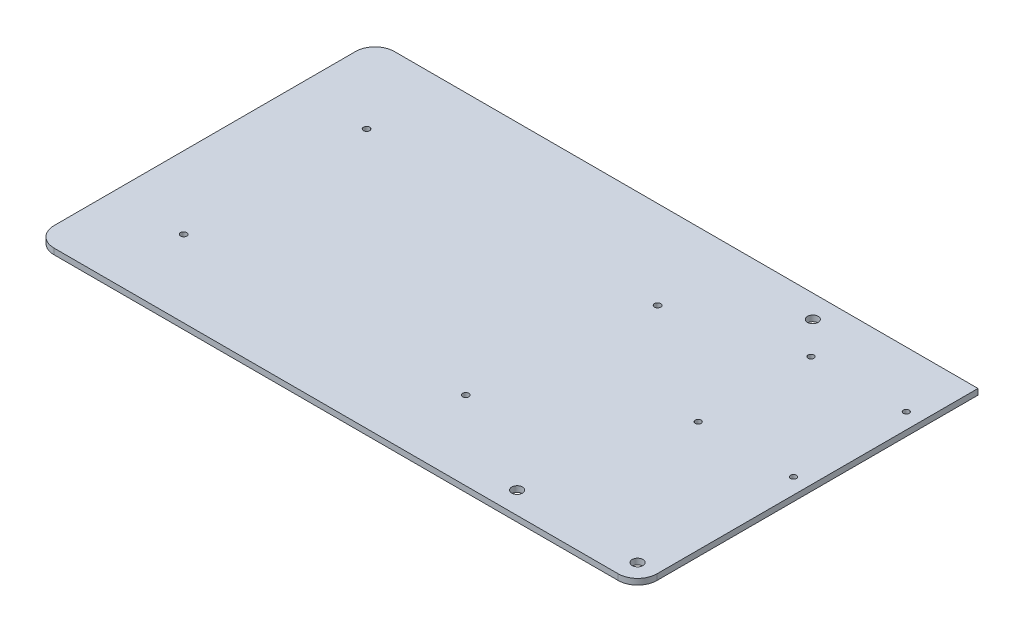
ISO-10303-21;
HEADER;
FILE_DESCRIPTION(('STEP AP214'),'2;1');
FILE_NAME('part.step','',(''),(''),'','','');
FILE_SCHEMA(('AUTOMOTIVE_DESIGN { 1 0 10303 214 1 1 1 1 }'));
ENDSEC;
DATA;
#1=APPLICATION_CONTEXT('core data for automotive mechanical design processes');
#2=APPLICATION_PROTOCOL_DEFINITION('international standard','automotive_design',2000,#1);
#3=PRODUCT_CONTEXT('',#1,'mechanical');
#4=PRODUCT('Part','Part','',(#3));
#5=PRODUCT_RELATED_PRODUCT_CATEGORY('part','',(#4));
#6=PRODUCT_DEFINITION_FORMATION('','',#4);
#7=PRODUCT_DEFINITION_CONTEXT('part definition',#1,'design');
#8=PRODUCT_DEFINITION('design','',#6,#7);
#9=PRODUCT_DEFINITION_SHAPE('','',#8);
#10=(LENGTH_UNIT() NAMED_UNIT(*) SI_UNIT(.MILLI.,.METRE.));
#11=(NAMED_UNIT(*) PLANE_ANGLE_UNIT() SI_UNIT($,.RADIAN.));
#12=(NAMED_UNIT(*) SI_UNIT($,.STERADIAN.) SOLID_ANGLE_UNIT());
#13=UNCERTAINTY_MEASURE_WITH_UNIT(LENGTH_MEASURE(1.E-05),#10,'distance_accuracy_value','');
#14=(GEOMETRIC_REPRESENTATION_CONTEXT(3) GLOBAL_UNCERTAINTY_ASSIGNED_CONTEXT((#13)) GLOBAL_UNIT_ASSIGNED_CONTEXT((#10,
#11,#12)) REPRESENTATION_CONTEXT('',''));
#15=CARTESIAN_POINT('',(0.,0.,0.));
#16=DIRECTION('',(0.,0.,1.));
#17=DIRECTION('',(1.,0.,0.));
#18=AXIS2_PLACEMENT_3D('',#15,#16,#17);
#19=CARTESIAN_POINT('',(153.857142857143,3.,72.5));
#20=DIRECTION('',(0.,-1.,0.));
#21=DIRECTION('',(0.,0.,-1.));
#22=AXIS2_PLACEMENT_3D('',#19,#20,#21);
#23=PLANE('',#22);
#24=CARTESIAN_POINT('',(-108.84020251006,3.,-50.8964243223789));
#25=DIRECTION('',(0.,1.,0.));
#26=DIRECTION('',(0.,0.,1.));
#27=AXIS2_PLACEMENT_3D('',#24,#25,#26);
#28=CIRCLE('',#27,1.60000000000001);
#29=CARTESIAN_POINT('',(-108.84020251006,3.,-49.2964243223789));
#30=VERTEX_POINT('',#29);
#31=EDGE_CURVE('E151',#30,#30,#28,.T.);
#32=ORIENTED_EDGE('',*,*,#31,.F.);
#33=EDGE_LOOP('',(#32));
#34=FACE_BOUND('',#33,.T.);
#35=CARTESIAN_POINT('',(44.5256505999403,3.,-47.1419603965457));
#36=DIRECTION('',(0.,1.,0.));
#37=DIRECTION('',(0.,0.,1.));
#38=AXIS2_PLACEMENT_3D('',#35,#36,#37);
#39=CIRCLE('',#38,1.60000000000001);
#40=CARTESIAN_POINT('',(44.5256505999403,3.,-45.5419603965457));
#41=VERTEX_POINT('',#40);
#42=EDGE_CURVE('E286',#41,#41,#39,.T.);
#43=ORIENTED_EDGE('',*,*,#42,.F.);
#44=EDGE_LOOP('',(#43));
#45=FACE_BOUND('',#44,.T.);
#46=CARTESIAN_POINT('',(35.1327993290717,3.,42.1235410340985));
#47=DIRECTION('',(0.,1.,0.));
#48=DIRECTION('',(0.,0.,1.));
#49=AXIS2_PLACEMENT_3D('',#46,#47,#48);
#50=CIRCLE('',#49,1.6);
#51=CARTESIAN_POINT('',(35.1327993290717,3.,43.7235410340985));
#52=VERTEX_POINT('',#51);
#53=EDGE_CURVE('E289',#52,#52,#50,.T.);
#54=ORIENTED_EDGE('',*,*,#53,.F.);
#55=EDGE_LOOP('',(#54));
#56=FACE_BOUND('',#55,.T.);
#57=CARTESIAN_POINT('',(-108.930202510928,3.,43.0535756746171));
#58=DIRECTION('',(0.,1.,0.));
#59=DIRECTION('',(0.,0.,1.));
#60=AXIS2_PLACEMENT_3D('',#57,#58,#59);
#61=CIRCLE('',#60,1.60000000000001);
#62=CARTESIAN_POINT('',(-108.930202510928,3.,44.6535756746171));
#63=VERTEX_POINT('',#62);
#64=EDGE_CURVE('E293',#63,#63,#61,.T.);
#65=ORIENTED_EDGE('',*,*,#64,.F.);
#66=EDGE_LOOP('',(#65));
#67=FACE_BOUND('',#66,.T.);
#68=DIRECTION('',(0.,0.,-1.));
#69=VECTOR('',#68,1.);
#70=CARTESIAN_POINT('',(163.857142857143,3.,-92.5));
#71=LINE('',#70,#69);
#72=CARTESIAN_POINT('',(163.857142857143,3.,72.4999999999999));
#73=VERTEX_POINT('',#72);
#74=CARTESIAN_POINT('',(163.857142857143,3.,-92.5));
#75=VERTEX_POINT('',#74);
#76=EDGE_CURVE('E138',#73,#75,#71,.T.);
#77=ORIENTED_EDGE('',*,*,#76,.T.);
#78=DIRECTION('',(-1.,0.,0.));
#79=VECTOR('',#78,1.);
#80=CARTESIAN_POINT('',(-136.142857142857,3.,-92.5));
#81=LINE('',#80,#79);
#82=CARTESIAN_POINT('',(-136.142857142857,3.,-92.5));
#83=VERTEX_POINT('',#82);
#84=EDGE_CURVE('E91',#75,#83,#81,.T.);
#85=ORIENTED_EDGE('',*,*,#84,.T.);
#86=CARTESIAN_POINT('',(-136.142857142857,3.,-82.5));
#87=DIRECTION('',(0.,1.,0.));
#88=DIRECTION('',(0.,0.,-1.));
#89=AXIS2_PLACEMENT_3D('',#86,#87,#88);
#90=CIRCLE('',#89,10.);
#91=CARTESIAN_POINT('',(-146.142857142857,3.,-82.5));
#92=VERTEX_POINT('',#91);
#93=EDGE_CURVE('E207',#83,#92,#90,.T.);
#94=ORIENTED_EDGE('',*,*,#93,.T.);
#95=DIRECTION('',(0.,0.,1.));
#96=VECTOR('',#95,1.);
#97=CARTESIAN_POINT('',(-146.142857142857,3.,-82.5));
#98=LINE('',#97,#96);
#99=CARTESIAN_POINT('',(-146.142857142857,3.,72.5));
#100=VERTEX_POINT('',#99);
#101=EDGE_CURVE('E107',#92,#100,#98,.T.);
#102=ORIENTED_EDGE('',*,*,#101,.T.);
#103=CARTESIAN_POINT('',(-136.142857142857,3.,72.5));
#104=DIRECTION('',(0.,1.,0.));
#105=DIRECTION('',(0.,0.,1.));
#106=AXIS2_PLACEMENT_3D('',#103,#104,#105);
#107=CIRCLE('',#106,10.0000000000001);
#108=CARTESIAN_POINT('',(-136.142857142857,3.,82.5));
#109=VERTEX_POINT('',#108);
#110=EDGE_CURVE('E101',#100,#109,#107,.T.);
#111=ORIENTED_EDGE('',*,*,#110,.T.);
#112=DIRECTION('',(1.,0.,0.));
#113=VECTOR('',#112,1.);
#114=CARTESIAN_POINT('',(153.857142857143,3.,82.5));
#115=LINE('',#114,#113);
#116=CARTESIAN_POINT('',(153.857142857143,3.,82.5));
#117=VERTEX_POINT('',#116);
#118=EDGE_CURVE('E105',#109,#117,#115,.T.);
#119=ORIENTED_EDGE('',*,*,#118,.T.);
#120=CARTESIAN_POINT('',(153.857142857143,3.,72.5));
#121=DIRECTION('',(0.,1.,0.));
#122=DIRECTION('',(0.,0.,-1.));
#123=AXIS2_PLACEMENT_3D('',#120,#121,#122);
#124=CIRCLE('',#123,10.);
#125=EDGE_CURVE('E51',#117,#73,#124,.T.);
#126=ORIENTED_EDGE('',*,*,#125,.T.);
#127=EDGE_LOOP('',(#77,#85,#94,#102,#111,#119,#126));
#128=FACE_BOUND('',#127,.T.);
#129=CARTESIAN_POINT('',(90.6433862703394,3.,-80.7999999999998));
#130=DIRECTION('',(0.,1.,0.));
#131=DIRECTION('',(0.,0.,1.));
#132=AXIS2_PLACEMENT_3D('',#129,#130,#131);
#133=CIRCLE('',#132,2.75000000000001);
#134=CARTESIAN_POINT('',(90.6433862703394,3.,-78.0499999999998));
#135=VERTEX_POINT('',#134);
#136=EDGE_CURVE('E129',#135,#135,#133,.T.);
#137=ORIENTED_EDGE('',*,*,#136,.F.);
#138=EDGE_LOOP('',(#137));
#139=FACE_BOUND('',#138,.T.);
#140=CARTESIAN_POINT('',(90.643386267811,3.,71.1999999908483));
#141=DIRECTION('',(0.,1.,0.));
#142=DIRECTION('',(0.,0.,1.));
#143=AXIS2_PLACEMENT_3D('',#140,#141,#142);
#144=CIRCLE('',#143,2.75000000000001);
#145=CARTESIAN_POINT('',(90.643386267811,3.,73.9499999908483));
#146=VERTEX_POINT('',#145);
#147=EDGE_CURVE('E195',#146,#146,#144,.T.);
#148=ORIENTED_EDGE('',*,*,#147,.F.);
#149=EDGE_LOOP('',(#148));
#150=FACE_BOUND('',#149,.T.);
#151=CARTESIAN_POINT('',(106.778088173037,3.,-63.7287511768893));
#152=DIRECTION('',(0.,1.,0.));
#153=DIRECTION('',(0.,0.,1.));
#154=AXIS2_PLACEMENT_3D('',#151,#152,#153);
#155=CIRCLE('',#154,1.5);
#156=CARTESIAN_POINT('',(106.778088173037,3.,-62.2287511768893));
#157=VERTEX_POINT('',#156);
#158=EDGE_CURVE('E189',#157,#157,#155,.T.);
#159=ORIENTED_EDGE('',*,*,#158,.F.);
#160=EDGE_LOOP('',(#159));
#161=FACE_BOUND('',#160,.T.);
#162=CARTESIAN_POINT('',(155.778088173037,3.,-63.7287511768893));
#163=DIRECTION('',(0.,1.,0.));
#164=DIRECTION('',(0.,0.,1.));
#165=AXIS2_PLACEMENT_3D('',#162,#163,#164);
#166=CIRCLE('',#165,1.5);
#167=CARTESIAN_POINT('',(155.778088173037,3.,-62.2287511768893));
#168=VERTEX_POINT('',#167);
#169=EDGE_CURVE('E183',#168,#168,#166,.T.);
#170=ORIENTED_EDGE('',*,*,#169,.F.);
#171=EDGE_LOOP('',(#170));
#172=FACE_BOUND('',#171,.T.);
#173=CARTESIAN_POINT('',(106.778088173037,3.,-5.72875117688936));
#174=DIRECTION('',(0.,1.,0.));
#175=DIRECTION('',(0.,0.,1.));
#176=AXIS2_PLACEMENT_3D('',#173,#174,#175);
#177=CIRCLE('',#176,1.5);
#178=CARTESIAN_POINT('',(106.778088173037,3.,-4.22875117688936));
#179=VERTEX_POINT('',#178);
#180=EDGE_CURVE('E177',#179,#179,#177,.T.);
#181=ORIENTED_EDGE('',*,*,#180,.F.);
#182=EDGE_LOOP('',(#181));
#183=FACE_BOUND('',#182,.T.);
#184=CARTESIAN_POINT('',(155.778088173037,3.,-5.72875117688936));
#185=DIRECTION('',(0.,1.,0.));
#186=DIRECTION('',(0.,0.,1.));
#187=AXIS2_PLACEMENT_3D('',#184,#185,#186);
#188=CIRCLE('',#187,1.5);
#189=CARTESIAN_POINT('',(155.778088173037,3.,-4.22875117688936));
#190=VERTEX_POINT('',#189);
#191=EDGE_CURVE('E171',#190,#190,#188,.T.);
#192=ORIENTED_EDGE('',*,*,#191,.F.);
#193=EDGE_LOOP('',(#192));
#194=FACE_BOUND('',#193,.T.);
#195=CARTESIAN_POINT('',(153.857142857143,3.,72.5));
#196=DIRECTION('',(0.,1.,0.));
#197=DIRECTION('',(0.,0.,1.));
#198=AXIS2_PLACEMENT_3D('',#195,#196,#197);
#199=CIRCLE('',#198,2.75000000000001);
#200=CARTESIAN_POINT('',(153.857142857143,3.,75.25));
#201=VERTEX_POINT('',#200);
#202=EDGE_CURVE('E162',#201,#201,#199,.T.);
#203=ORIENTED_EDGE('',*,*,#202,.F.);
#204=EDGE_LOOP('',(#203));
#205=FACE_BOUND('',#204,.T.);
#206=ADVANCED_FACE('F32',(#34,#45,#56,#67,#128,#139,#150,#161,#172,#183,#194,#205),#23,.F.);
#207=CARTESIAN_POINT('',(153.857142857143,0.,72.5));
#208=DIRECTION('',(0.,-1.,0.));
#209=DIRECTION('',(0.,0.,-1.));
#210=AXIS2_PLACEMENT_3D('',#207,#208,#209);
#211=PLANE('',#210);
#212=CARTESIAN_POINT('',(-108.84020251006,0.,-50.8964243223789));
#213=DIRECTION('',(0.,-1.,0.));
#214=DIRECTION('',(0.,0.,-1.));
#215=AXIS2_PLACEMENT_3D('',#212,#213,#214);
#216=CIRCLE('',#215,1.60000000000001);
#217=CARTESIAN_POINT('',(-108.84020251006,0.,-52.4964243223789));
#218=VERTEX_POINT('',#217);
#219=EDGE_CURVE('E36',#218,#218,#216,.T.);
#220=ORIENTED_EDGE('',*,*,#219,.F.);
#221=EDGE_LOOP('',(#220));
#222=FACE_BOUND('',#221,.T.);
#223=CARTESIAN_POINT('',(44.5256505999403,0.,-47.1419603965457));
#224=DIRECTION('',(0.,-1.,0.));
#225=DIRECTION('',(0.,0.,-1.));
#226=AXIS2_PLACEMENT_3D('',#223,#224,#225);
#227=CIRCLE('',#226,1.60000000000001);
#228=CARTESIAN_POINT('',(44.5256505999403,0.,-48.7419603965457));
#229=VERTEX_POINT('',#228);
#230=EDGE_CURVE('E153',#229,#229,#227,.T.);
#231=ORIENTED_EDGE('',*,*,#230,.F.);
#232=EDGE_LOOP('',(#231));
#233=FACE_BOUND('',#232,.T.);
#234=CARTESIAN_POINT('',(35.1327993290717,0.,42.1235410340985));
#235=DIRECTION('',(0.,-1.,0.));
#236=DIRECTION('',(0.,0.,-1.));
#237=AXIS2_PLACEMENT_3D('',#234,#235,#236);
#238=CIRCLE('',#237,1.6);
#239=CARTESIAN_POINT('',(35.1327993290717,0.,40.5235410340985));
#240=VERTEX_POINT('',#239);
#241=EDGE_CURVE('E150',#240,#240,#238,.T.);
#242=ORIENTED_EDGE('',*,*,#241,.F.);
#243=EDGE_LOOP('',(#242));
#244=FACE_BOUND('',#243,.T.);
#245=CARTESIAN_POINT('',(-108.930202510928,0.,43.0535756746171));
#246=DIRECTION('',(0.,-1.,0.));
#247=DIRECTION('',(0.,0.,-1.));
#248=AXIS2_PLACEMENT_3D('',#245,#246,#247);
#249=CIRCLE('',#248,1.60000000000001);
#250=CARTESIAN_POINT('',(-108.930202510928,0.,41.4535756746171));
#251=VERTEX_POINT('',#250);
#252=EDGE_CURVE('E147',#251,#251,#249,.T.);
#253=ORIENTED_EDGE('',*,*,#252,.F.);
#254=EDGE_LOOP('',(#253));
#255=FACE_BOUND('',#254,.T.);
#256=CARTESIAN_POINT('',(155.778088173037,0.,-5.72875117688936));
#257=DIRECTION('',(0.,1.,0.));
#258=DIRECTION('',(0.,0.,1.));
#259=AXIS2_PLACEMENT_3D('',#256,#257,#258);
#260=CIRCLE('',#259,1.5);
#261=CARTESIAN_POINT('',(155.778088173037,0.,-4.22875117688936));
#262=VERTEX_POINT('',#261);
#263=EDGE_CURVE('E167',#262,#262,#260,.T.);
#264=ORIENTED_EDGE('',*,*,#263,.T.);
#265=EDGE_LOOP('',(#264));
#266=FACE_BOUND('',#265,.T.);
#267=CARTESIAN_POINT('',(155.778088173037,0.,-63.7287511768893));
#268=DIRECTION('',(0.,1.,0.));
#269=DIRECTION('',(0.,0.,1.));
#270=AXIS2_PLACEMENT_3D('',#267,#268,#269);
#271=CIRCLE('',#270,1.5);
#272=CARTESIAN_POINT('',(155.778088173037,0.,-62.2287511768893));
#273=VERTEX_POINT('',#272);
#274=EDGE_CURVE('E180',#273,#273,#271,.T.);
#275=ORIENTED_EDGE('',*,*,#274,.T.);
#276=EDGE_LOOP('',(#275));
#277=FACE_BOUND('',#276,.T.);
#278=CARTESIAN_POINT('',(90.643386267811,0.,71.1999999908483));
#279=DIRECTION('',(0.,1.,0.));
#280=DIRECTION('',(0.,0.,1.));
#281=AXIS2_PLACEMENT_3D('',#278,#279,#280);
#282=CIRCLE('',#281,2.75000000000001);
#283=CARTESIAN_POINT('',(90.643386267811,0.,73.9499999908483));
#284=VERTEX_POINT('',#283);
#285=EDGE_CURVE('E192',#284,#284,#282,.T.);
#286=ORIENTED_EDGE('',*,*,#285,.T.);
#287=EDGE_LOOP('',(#286));
#288=FACE_BOUND('',#287,.T.);
#289=DIRECTION('',(0.,0.,-1.));
#290=VECTOR('',#289,1.);
#291=CARTESIAN_POINT('',(163.857142857143,0.,-92.5));
#292=LINE('',#291,#290);
#293=CARTESIAN_POINT('',(163.857142857143,0.,72.4999999999999));
#294=VERTEX_POINT('',#293);
#295=CARTESIAN_POINT('',(163.857142857143,0.,-92.5));
#296=VERTEX_POINT('',#295);
#297=EDGE_CURVE('E125',#294,#296,#292,.T.);
#298=ORIENTED_EDGE('',*,*,#297,.F.);
#299=CARTESIAN_POINT('',(153.857142857143,0.,72.5));
#300=DIRECTION('',(0.,1.,0.));
#301=DIRECTION('',(0.,0.,-1.));
#302=AXIS2_PLACEMENT_3D('',#299,#300,#301);
#303=CIRCLE('',#302,10.);
#304=CARTESIAN_POINT('',(153.857142857143,0.,82.5));
#305=VERTEX_POINT('',#304);
#306=EDGE_CURVE('E83',#305,#294,#303,.T.);
#307=ORIENTED_EDGE('',*,*,#306,.F.);
#308=DIRECTION('',(1.,0.,0.));
#309=VECTOR('',#308,1.);
#310=CARTESIAN_POINT('',(153.857142857143,0.,82.5));
#311=LINE('',#310,#309);
#312=CARTESIAN_POINT('',(-136.142857142857,0.,82.5));
#313=VERTEX_POINT('',#312);
#314=EDGE_CURVE('E77',#313,#305,#311,.T.);
#315=ORIENTED_EDGE('',*,*,#314,.F.);
#316=CARTESIAN_POINT('',(-136.142857142857,0.,72.5));
#317=DIRECTION('',(0.,1.,0.));
#318=DIRECTION('',(0.,0.,1.));
#319=AXIS2_PLACEMENT_3D('',#316,#317,#318);
#320=CIRCLE('',#319,10.0000000000001);
#321=CARTESIAN_POINT('',(-146.142857142857,0.,72.5));
#322=VERTEX_POINT('',#321);
#323=EDGE_CURVE('E115',#322,#313,#320,.T.);
#324=ORIENTED_EDGE('',*,*,#323,.F.);
#325=DIRECTION('',(0.,0.,1.));
#326=VECTOR('',#325,1.);
#327=CARTESIAN_POINT('',(-146.142857142857,0.,-82.5));
#328=LINE('',#327,#326);
#329=CARTESIAN_POINT('',(-146.142857142857,0.,-82.5));
#330=VERTEX_POINT('',#329);
#331=EDGE_CURVE('E133',#330,#322,#328,.T.);
#332=ORIENTED_EDGE('',*,*,#331,.F.);
#333=CARTESIAN_POINT('',(-136.142857142857,0.,-82.5));
#334=DIRECTION('',(0.,1.,0.));
#335=DIRECTION('',(0.,0.,-1.));
#336=AXIS2_PLACEMENT_3D('',#333,#334,#335);
#337=CIRCLE('',#336,10.);
#338=CARTESIAN_POINT('',(-136.142857142857,0.,-92.5));
#339=VERTEX_POINT('',#338);
#340=EDGE_CURVE('E131',#339,#330,#337,.T.);
#341=ORIENTED_EDGE('',*,*,#340,.F.);
#342=DIRECTION('',(-1.,0.,0.));
#343=VECTOR('',#342,1.);
#344=CARTESIAN_POINT('',(-136.142857142857,0.,-92.5));
#345=LINE('',#344,#343);
#346=EDGE_CURVE('E128',#296,#339,#345,.T.);
#347=ORIENTED_EDGE('',*,*,#346,.F.);
#348=EDGE_LOOP('',(#298,#307,#315,#324,#332,#341,#347));
#349=FACE_BOUND('',#348,.T.);
#350=CARTESIAN_POINT('',(90.6433862703394,0.,-80.7999999999998));
#351=DIRECTION('',(0.,1.,0.));
#352=DIRECTION('',(0.,0.,1.));
#353=AXIS2_PLACEMENT_3D('',#350,#351,#352);
#354=CIRCLE('',#353,2.75000000000001);
#355=CARTESIAN_POINT('',(90.6433862703394,0.,-78.0499999999998));
#356=VERTEX_POINT('',#355);
#357=EDGE_CURVE('E198',#356,#356,#354,.T.);
#358=ORIENTED_EDGE('',*,*,#357,.T.);
#359=EDGE_LOOP('',(#358));
#360=FACE_BOUND('',#359,.T.);
#361=CARTESIAN_POINT('',(106.778088173037,0.,-63.7287511768893));
#362=DIRECTION('',(0.,1.,0.));
#363=DIRECTION('',(0.,0.,1.));
#364=AXIS2_PLACEMENT_3D('',#361,#362,#363);
#365=CIRCLE('',#364,1.5);
#366=CARTESIAN_POINT('',(106.778088173037,0.,-62.2287511768893));
#367=VERTEX_POINT('',#366);
#368=EDGE_CURVE('E186',#367,#367,#365,.T.);
#369=ORIENTED_EDGE('',*,*,#368,.T.);
#370=EDGE_LOOP('',(#369));
#371=FACE_BOUND('',#370,.T.);
#372=CARTESIAN_POINT('',(106.778088173037,0.,-5.72875117688936));
#373=DIRECTION('',(0.,1.,0.));
#374=DIRECTION('',(0.,0.,1.));
#375=AXIS2_PLACEMENT_3D('',#372,#373,#374);
#376=CIRCLE('',#375,1.5);
#377=CARTESIAN_POINT('',(106.778088173037,0.,-4.22875117688936));
#378=VERTEX_POINT('',#377);
#379=EDGE_CURVE('E174',#378,#378,#376,.T.);
#380=ORIENTED_EDGE('',*,*,#379,.T.);
#381=EDGE_LOOP('',(#380));
#382=FACE_BOUND('',#381,.T.);
#383=CARTESIAN_POINT('',(153.857142857143,0.,72.5));
#384=DIRECTION('',(0.,1.,0.));
#385=DIRECTION('',(0.,0.,1.));
#386=AXIS2_PLACEMENT_3D('',#383,#384,#385);
#387=CIRCLE('',#386,2.75000000000001);
#388=CARTESIAN_POINT('',(153.857142857143,0.,75.25));
#389=VERTEX_POINT('',#388);
#390=EDGE_CURVE('E158',#389,#389,#387,.T.);
#391=ORIENTED_EDGE('',*,*,#390,.T.);
#392=EDGE_LOOP('',(#391));
#393=FACE_BOUND('',#392,.T.);
#394=ADVANCED_FACE('F218',(#222,#233,#244,#255,#266,#277,#288,#349,#360,#371,#382,#393),#211,.T.);
#395=CARTESIAN_POINT('',(163.857142857143,3.,-92.5));
#396=DIRECTION('',(-1.,0.,0.));
#397=DIRECTION('',(0.,0.,1.));
#398=AXIS2_PLACEMENT_3D('',#395,#396,#397);
#399=PLANE('',#398);
#400=ORIENTED_EDGE('',*,*,#297,.T.);
#401=DIRECTION('',(0.,-1.,0.));
#402=VECTOR('',#401,1.);
#403=CARTESIAN_POINT('',(163.857142857143,3.,-92.5));
#404=LINE('',#403,#402);
#405=EDGE_CURVE('E11',#75,#296,#404,.T.);
#406=ORIENTED_EDGE('',*,*,#405,.F.);
#407=ORIENTED_EDGE('',*,*,#76,.F.);
#408=DIRECTION('',(0.,-1.,0.));
#409=VECTOR('',#408,1.);
#410=CARTESIAN_POINT('',(163.857142857143,3.,72.4999999999999));
#411=LINE('',#410,#409);
#412=EDGE_CURVE('E121',#73,#294,#411,.T.);
#413=ORIENTED_EDGE('',*,*,#412,.T.);
#414=EDGE_LOOP('',(#400,#406,#407,#413));
#415=FACE_BOUND('',#414,.T.);
#416=ADVANCED_FACE('F34',(#415),#399,.F.);
#417=CARTESIAN_POINT('',(-136.142857142857,3.,-92.5));
#418=DIRECTION('',(0.,0.,1.));
#419=DIRECTION('',(1.,0.,0.));
#420=AXIS2_PLACEMENT_3D('',#417,#418,#419);
#421=PLANE('',#420);
#422=ORIENTED_EDGE('',*,*,#346,.T.);
#423=DIRECTION('',(0.,-1.,0.));
#424=VECTOR('',#423,1.);
#425=CARTESIAN_POINT('',(-136.142857142857,3.,-92.5));
#426=LINE('',#425,#424);
#427=EDGE_CURVE('E42',#83,#339,#426,.T.);
#428=ORIENTED_EDGE('',*,*,#427,.F.);
#429=ORIENTED_EDGE('',*,*,#84,.F.);
#430=ORIENTED_EDGE('',*,*,#405,.T.);
#431=EDGE_LOOP('',(#422,#428,#429,#430));
#432=FACE_BOUND('',#431,.T.);
#433=ADVANCED_FACE('F379',(#432),#421,.F.);
#434=CARTESIAN_POINT('',(-136.142857142857,3.,-82.5));
#435=DIRECTION('',(0.,-1.,0.));
#436=DIRECTION('',(0.,0.,-1.));
#437=AXIS2_PLACEMENT_3D('',#434,#435,#436);
#438=CYLINDRICAL_SURFACE('',#437,10.);
#439=ORIENTED_EDGE('',*,*,#340,.T.);
#440=DIRECTION('',(0.,-1.,0.));
#441=VECTOR('',#440,1.);
#442=CARTESIAN_POINT('',(-146.142857142857,3.,-82.5));
#443=LINE('',#442,#441);
#444=EDGE_CURVE('E142',#92,#330,#443,.T.);
#445=ORIENTED_EDGE('',*,*,#444,.F.);
#446=ORIENTED_EDGE('',*,*,#93,.F.);
#447=ORIENTED_EDGE('',*,*,#427,.T.);
#448=EDGE_LOOP('',(#439,#445,#446,#447));
#449=FACE_BOUND('',#448,.T.);
#450=ADVANCED_FACE('F211',(#449),#438,.T.);
#451=CARTESIAN_POINT('',(-146.142857142857,3.,-82.5));
#452=DIRECTION('',(1.,0.,0.));
#453=DIRECTION('',(0.,0.,-1.));
#454=AXIS2_PLACEMENT_3D('',#451,#452,#453);
#455=PLANE('',#454);
#456=ORIENTED_EDGE('',*,*,#331,.T.);
#457=DIRECTION('',(0.,-1.,0.));
#458=VECTOR('',#457,1.);
#459=CARTESIAN_POINT('',(-146.142857142857,3.,72.5));
#460=LINE('',#459,#458);
#461=EDGE_CURVE('E116',#100,#322,#460,.T.);
#462=ORIENTED_EDGE('',*,*,#461,.F.);
#463=ORIENTED_EDGE('',*,*,#101,.F.);
#464=ORIENTED_EDGE('',*,*,#444,.T.);
#465=EDGE_LOOP('',(#456,#462,#463,#464));
#466=FACE_BOUND('',#465,.T.);
#467=ADVANCED_FACE('F215',(#466),#455,.F.);
#468=CARTESIAN_POINT('',(-136.142857142857,3.,72.5));
#469=DIRECTION('',(0.,-1.,0.));
#470=DIRECTION('',(0.,0.,-1.));
#471=AXIS2_PLACEMENT_3D('',#468,#469,#470);
#472=CYLINDRICAL_SURFACE('',#471,10.0000000000001);
#473=ORIENTED_EDGE('',*,*,#323,.T.);
#474=DIRECTION('',(0.,-1.,0.));
#475=VECTOR('',#474,1.);
#476=CARTESIAN_POINT('',(-136.142857142857,3.,82.5));
#477=LINE('',#476,#475);
#478=EDGE_CURVE('E112',#109,#313,#477,.T.);
#479=ORIENTED_EDGE('',*,*,#478,.F.);
#480=ORIENTED_EDGE('',*,*,#110,.F.);
#481=ORIENTED_EDGE('',*,*,#461,.T.);
#482=EDGE_LOOP('',(#473,#479,#480,#481));
#483=FACE_BOUND('',#482,.T.);
#484=ADVANCED_FACE('F113',(#483),#472,.T.);
#485=CARTESIAN_POINT('',(153.857142857143,3.,82.5));
#486=DIRECTION('',(0.,0.,-1.));
#487=DIRECTION('',(-1.,0.,0.));
#488=AXIS2_PLACEMENT_3D('',#485,#486,#487);
#489=PLANE('',#488);
#490=ORIENTED_EDGE('',*,*,#314,.T.);
#491=DIRECTION('',(0.,-1.,0.));
#492=VECTOR('',#491,1.);
#493=CARTESIAN_POINT('',(153.857142857143,3.,82.5));
#494=LINE('',#493,#492);
#495=EDGE_CURVE('E117',#117,#305,#494,.T.);
#496=ORIENTED_EDGE('',*,*,#495,.F.);
#497=ORIENTED_EDGE('',*,*,#118,.F.);
#498=ORIENTED_EDGE('',*,*,#478,.T.);
#499=EDGE_LOOP('',(#490,#496,#497,#498));
#500=FACE_BOUND('',#499,.T.);
#501=ADVANCED_FACE('F119',(#500),#489,.F.);
#502=CARTESIAN_POINT('',(153.857142857143,3.,72.5));
#503=DIRECTION('',(0.,-1.,0.));
#504=DIRECTION('',(0.,0.,-1.));
#505=AXIS2_PLACEMENT_3D('',#502,#503,#504);
#506=CYLINDRICAL_SURFACE('',#505,10.);
#507=ORIENTED_EDGE('',*,*,#306,.T.);
#508=ORIENTED_EDGE('',*,*,#412,.F.);
#509=ORIENTED_EDGE('',*,*,#125,.F.);
#510=ORIENTED_EDGE('',*,*,#495,.T.);
#511=EDGE_LOOP('',(#507,#508,#509,#510));
#512=FACE_BOUND('',#511,.T.);
#513=ADVANCED_FACE('F223',(#512),#506,.T.);
#514=CARTESIAN_POINT('',(90.6433862703394,3.,-80.7999999999998));
#515=DIRECTION('',(0.,-1.,0.));
#516=DIRECTION('',(0.,0.,-1.));
#517=AXIS2_PLACEMENT_3D('',#514,#515,#516);
#518=CYLINDRICAL_SURFACE('',#517,2.75000000000001);
#519=ORIENTED_EDGE('',*,*,#136,.T.);
#520=EDGE_LOOP('',(#519));
#521=FACE_BOUND('',#520,.T.);
#522=ORIENTED_EDGE('',*,*,#357,.F.);
#523=EDGE_LOOP('',(#522));
#524=FACE_BOUND('',#523,.T.);
#525=ADVANCED_FACE('F225',(#521,#524),#518,.F.);
#526=CARTESIAN_POINT('',(90.643386267811,3.,71.1999999908483));
#527=DIRECTION('',(0.,-1.,0.));
#528=DIRECTION('',(0.,0.,-1.));
#529=AXIS2_PLACEMENT_3D('',#526,#527,#528);
#530=CYLINDRICAL_SURFACE('',#529,2.75000000000001);
#531=ORIENTED_EDGE('',*,*,#147,.T.);
#532=EDGE_LOOP('',(#531));
#533=FACE_BOUND('',#532,.T.);
#534=ORIENTED_EDGE('',*,*,#285,.F.);
#535=EDGE_LOOP('',(#534));
#536=FACE_BOUND('',#535,.T.);
#537=ADVANCED_FACE('F231',(#533,#536),#530,.F.);
#538=CARTESIAN_POINT('',(106.778088173037,3.,-63.7287511768893));
#539=DIRECTION('',(0.,-1.,0.));
#540=DIRECTION('',(0.,0.,-1.));
#541=AXIS2_PLACEMENT_3D('',#538,#539,#540);
#542=CYLINDRICAL_SURFACE('',#541,1.5);
#543=ORIENTED_EDGE('',*,*,#158,.T.);
#544=EDGE_LOOP('',(#543));
#545=FACE_BOUND('',#544,.T.);
#546=ORIENTED_EDGE('',*,*,#368,.F.);
#547=EDGE_LOOP('',(#546));
#548=FACE_BOUND('',#547,.T.);
#549=ADVANCED_FACE('F248',(#545,#548),#542,.F.);
#550=CARTESIAN_POINT('',(155.778088173037,3.,-63.7287511768893));
#551=DIRECTION('',(0.,-1.,0.));
#552=DIRECTION('',(0.,0.,-1.));
#553=AXIS2_PLACEMENT_3D('',#550,#551,#552);
#554=CYLINDRICAL_SURFACE('',#553,1.5);
#555=ORIENTED_EDGE('',*,*,#169,.T.);
#556=EDGE_LOOP('',(#555));
#557=FACE_BOUND('',#556,.T.);
#558=ORIENTED_EDGE('',*,*,#274,.F.);
#559=EDGE_LOOP('',(#558));
#560=FACE_BOUND('',#559,.T.);
#561=ADVANCED_FACE('F252',(#557,#560),#554,.F.);
#562=CARTESIAN_POINT('',(106.778088173037,3.,-5.72875117688936));
#563=DIRECTION('',(0.,-1.,0.));
#564=DIRECTION('',(0.,0.,-1.));
#565=AXIS2_PLACEMENT_3D('',#562,#563,#564);
#566=CYLINDRICAL_SURFACE('',#565,1.5);
#567=ORIENTED_EDGE('',*,*,#180,.T.);
#568=EDGE_LOOP('',(#567));
#569=FACE_BOUND('',#568,.T.);
#570=ORIENTED_EDGE('',*,*,#379,.F.);
#571=EDGE_LOOP('',(#570));
#572=FACE_BOUND('',#571,.T.);
#573=ADVANCED_FACE('F256',(#569,#572),#566,.F.);
#574=CARTESIAN_POINT('',(155.778088173037,3.,-5.72875117688936));
#575=DIRECTION('',(0.,-1.,0.));
#576=DIRECTION('',(0.,0.,-1.));
#577=AXIS2_PLACEMENT_3D('',#574,#575,#576);
#578=CYLINDRICAL_SURFACE('',#577,1.5);
#579=ORIENTED_EDGE('',*,*,#191,.T.);
#580=EDGE_LOOP('',(#579));
#581=FACE_BOUND('',#580,.T.);
#582=ORIENTED_EDGE('',*,*,#263,.F.);
#583=EDGE_LOOP('',(#582));
#584=FACE_BOUND('',#583,.T.);
#585=ADVANCED_FACE('F260',(#581,#584),#578,.F.);
#586=CARTESIAN_POINT('',(153.857142857143,3.,72.5));
#587=DIRECTION('',(0.,-1.,0.));
#588=DIRECTION('',(0.,0.,-1.));
#589=AXIS2_PLACEMENT_3D('',#586,#587,#588);
#590=CYLINDRICAL_SURFACE('',#589,2.75000000000001);
#591=ORIENTED_EDGE('',*,*,#202,.T.);
#592=EDGE_LOOP('',(#591));
#593=FACE_BOUND('',#592,.T.);
#594=ORIENTED_EDGE('',*,*,#390,.F.);
#595=EDGE_LOOP('',(#594));
#596=FACE_BOUND('',#595,.T.);
#597=ADVANCED_FACE('F264',(#593,#596),#590,.F.);
#598=CARTESIAN_POINT('',(-108.930202510928,-7.,43.0535756746171));
#599=DIRECTION('',(0.,1.,0.));
#600=DIRECTION('',(0.,0.,1.));
#601=AXIS2_PLACEMENT_3D('',#598,#599,#600);
#602=CYLINDRICAL_SURFACE('',#601,1.60000000000001);
#603=ORIENTED_EDGE('',*,*,#252,.T.);
#604=EDGE_LOOP('',(#603));
#605=FACE_BOUND('',#604,.T.);
#606=ORIENTED_EDGE('',*,*,#64,.T.);
#607=EDGE_LOOP('',(#606));
#608=FACE_BOUND('',#607,.T.);
#609=ADVANCED_FACE('F268',(#605,#608),#602,.F.);
#610=CARTESIAN_POINT('',(35.1327993290717,-7.,42.1235410340985));
#611=DIRECTION('',(0.,1.,0.));
#612=DIRECTION('',(0.,0.,1.));
#613=AXIS2_PLACEMENT_3D('',#610,#611,#612);
#614=CYLINDRICAL_SURFACE('',#613,1.6);
#615=ORIENTED_EDGE('',*,*,#241,.T.);
#616=EDGE_LOOP('',(#615));
#617=FACE_BOUND('',#616,.T.);
#618=ORIENTED_EDGE('',*,*,#53,.T.);
#619=EDGE_LOOP('',(#618));
#620=FACE_BOUND('',#619,.T.);
#621=ADVANCED_FACE('F272',(#617,#620),#614,.F.);
#622=CARTESIAN_POINT('',(44.5256505999403,-7.,-47.1419603965457));
#623=DIRECTION('',(0.,1.,0.));
#624=DIRECTION('',(0.,0.,1.));
#625=AXIS2_PLACEMENT_3D('',#622,#623,#624);
#626=CYLINDRICAL_SURFACE('',#625,1.60000000000001);
#627=ORIENTED_EDGE('',*,*,#230,.T.);
#628=EDGE_LOOP('',(#627));
#629=FACE_BOUND('',#628,.T.);
#630=ORIENTED_EDGE('',*,*,#42,.T.);
#631=EDGE_LOOP('',(#630));
#632=FACE_BOUND('',#631,.T.);
#633=ADVANCED_FACE('F276',(#629,#632),#626,.F.);
#634=CARTESIAN_POINT('',(-108.84020251006,-7.,-50.8964243223789));
#635=DIRECTION('',(0.,1.,0.));
#636=DIRECTION('',(0.,0.,1.));
#637=AXIS2_PLACEMENT_3D('',#634,#635,#636);
#638=CYLINDRICAL_SURFACE('',#637,1.60000000000001);
#639=ORIENTED_EDGE('',*,*,#219,.T.);
#640=EDGE_LOOP('',(#639));
#641=FACE_BOUND('',#640,.T.);
#642=ORIENTED_EDGE('',*,*,#31,.T.);
#643=EDGE_LOOP('',(#642));
#644=FACE_BOUND('',#643,.T.);
#645=ADVANCED_FACE('F280',(#641,#644),#638,.F.);
#646=CLOSED_SHELL('',(#206,#394,#416,#433,#450,#467,#484,#501,#513,#525,#537,#549,#561,#573,
#585,#597,#609,#621,#633,#645));
#647=MANIFOLD_SOLID_BREP('B2',#646);
#648=ADVANCED_BREP_SHAPE_REPRESENTATION('',(#18,#647),#14);
#649=SHAPE_DEFINITION_REPRESENTATION(#9,#648);
ENDSEC;
END-ISO-10303-21;
